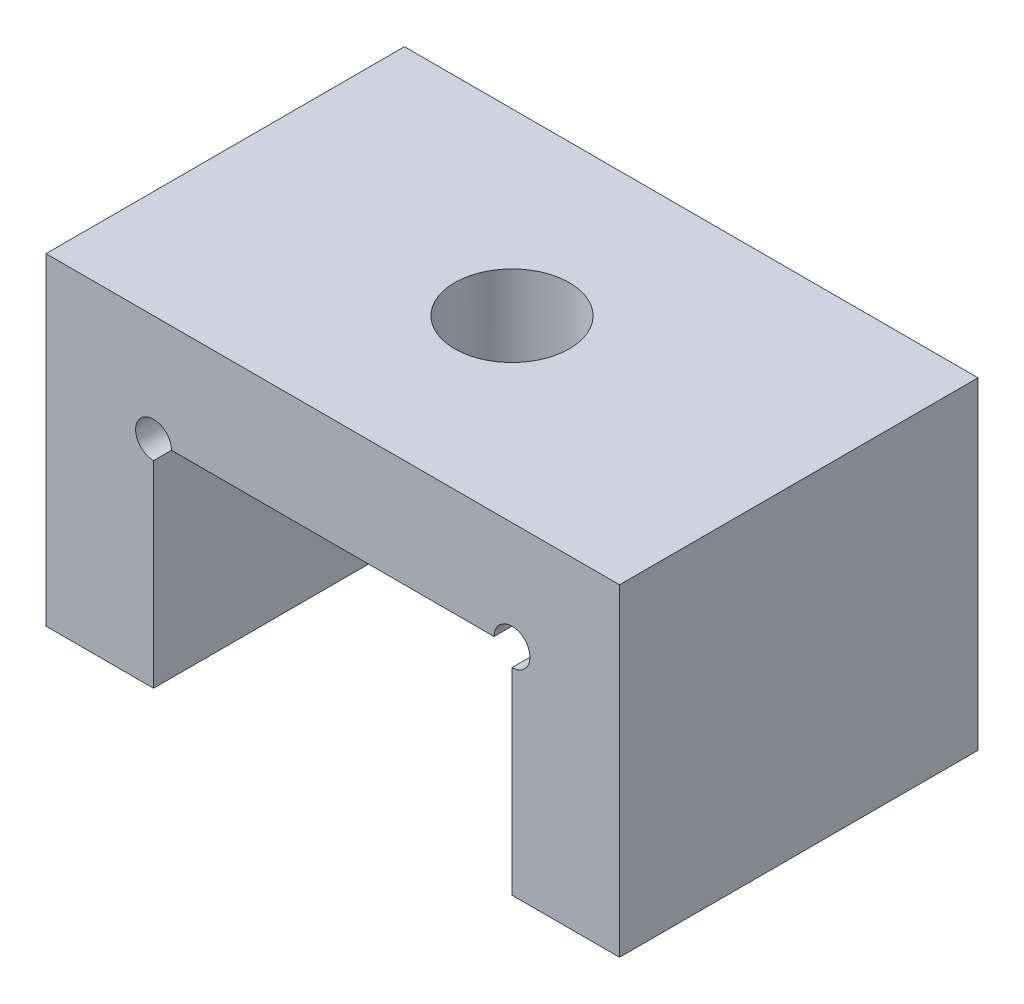
ISO-10303-21;
HEADER;
FILE_DESCRIPTION(('STEP AP214'),'2;1');
FILE_NAME('part.step','',(''),(''),'','','');
FILE_SCHEMA(('AUTOMOTIVE_DESIGN { 1 0 10303 214 1 1 1 1 }'));
ENDSEC;
DATA;
#1=APPLICATION_CONTEXT('core data for automotive mechanical design processes');
#2=APPLICATION_PROTOCOL_DEFINITION('international standard','automotive_design',2000,#1);
#3=PRODUCT_CONTEXT('',#1,'mechanical');
#4=PRODUCT('Part','Part','',(#3));
#5=PRODUCT_RELATED_PRODUCT_CATEGORY('part','',(#4));
#6=PRODUCT_DEFINITION_FORMATION('','',#4);
#7=PRODUCT_DEFINITION_CONTEXT('part definition',#1,'design');
#8=PRODUCT_DEFINITION('design','',#6,#7);
#9=PRODUCT_DEFINITION_SHAPE('','',#8);
#10=(LENGTH_UNIT() NAMED_UNIT(*) SI_UNIT(.MILLI.,.METRE.));
#11=(NAMED_UNIT(*) PLANE_ANGLE_UNIT() SI_UNIT($,.RADIAN.));
#12=(NAMED_UNIT(*) SI_UNIT($,.STERADIAN.) SOLID_ANGLE_UNIT());
#13=UNCERTAINTY_MEASURE_WITH_UNIT(LENGTH_MEASURE(1.E-05),#10,'distance_accuracy_value','');
#14=(GEOMETRIC_REPRESENTATION_CONTEXT(3) GLOBAL_UNCERTAINTY_ASSIGNED_CONTEXT((#13)) GLOBAL_UNIT_ASSIGNED_CONTEXT((#10,
#11,#12)) REPRESENTATION_CONTEXT('',''));
#15=CARTESIAN_POINT('',(0.,0.,0.));
#16=DIRECTION('',(0.,0.,1.));
#17=DIRECTION('',(1.,0.,0.));
#18=AXIS2_PLACEMENT_3D('',#15,#16,#17);
#19=CARTESIAN_POINT('',(0.,0.,10.));
#20=DIRECTION('',(0.,-1.,0.));
#21=DIRECTION('',(0.,0.,-1.));
#22=AXIS2_PLACEMENT_3D('',#19,#20,#21);
#23=PLANE('',#22);
#24=CARTESIAN_POINT('',(0.,0.,5.));
#25=DIRECTION('',(0.,1.,0.));
#26=DIRECTION('',(0.,0.,1.));
#27=AXIS2_PLACEMENT_3D('',#24,#25,#26);
#28=CIRCLE('',#27,1.6);
#29=CARTESIAN_POINT('',(0.,0.,6.6));
#30=VERTEX_POINT('',#29);
#31=EDGE_CURVE('E164',#30,#30,#28,.T.);
#32=ORIENTED_EDGE('',*,*,#31,.F.);
#33=EDGE_LOOP('',(#32));
#34=FACE_BOUND('',#33,.T.);
#35=DIRECTION('',(-1.,0.,0.));
#36=VECTOR('',#35,1.);
#37=CARTESIAN_POINT('',(0.,0.,0.));
#38=LINE('',#37,#36);
#39=CARTESIAN_POINT('',(8.,0.,0.));
#40=VERTEX_POINT('',#39);
#41=CARTESIAN_POINT('',(-8.,0.,0.));
#42=VERTEX_POINT('',#41);
#43=EDGE_CURVE('E163',#40,#42,#38,.T.);
#44=ORIENTED_EDGE('',*,*,#43,.T.);
#45=DIRECTION('',(0.,0.,-1.));
#46=VECTOR('',#45,1.);
#47=CARTESIAN_POINT('',(-8.,0.,10.));
#48=LINE('',#47,#46);
#49=CARTESIAN_POINT('',(-8.,0.,10.));
#50=VERTEX_POINT('',#49);
#51=EDGE_CURVE('E48',#50,#42,#48,.T.);
#52=ORIENTED_EDGE('',*,*,#51,.F.);
#53=DIRECTION('',(-1.,0.,0.));
#54=VECTOR('',#53,1.);
#55=CARTESIAN_POINT('',(8.,0.,10.));
#56=LINE('',#55,#54);
#57=CARTESIAN_POINT('',(8.,0.,10.));
#58=VERTEX_POINT('',#57);
#59=EDGE_CURVE('E144',#58,#50,#56,.T.);
#60=ORIENTED_EDGE('',*,*,#59,.F.);
#61=DIRECTION('',(0.,0.,-1.));
#62=VECTOR('',#61,1.);
#63=CARTESIAN_POINT('',(8.,0.,10.));
#64=LINE('',#63,#62);
#65=EDGE_CURVE('E145',#58,#40,#64,.T.);
#66=ORIENTED_EDGE('',*,*,#65,.T.);
#67=EDGE_LOOP('',(#44,#52,#60,#66));
#68=FACE_BOUND('',#67,.T.);
#69=ADVANCED_FACE('F41',(#34,#68),#23,.F.);
#70=CARTESIAN_POINT('',(-8.,0.,10.));
#71=DIRECTION('',(1.,0.,0.));
#72=DIRECTION('',(0.,0.,-1.));
#73=AXIS2_PLACEMENT_3D('',#70,#71,#72);
#74=PLANE('',#73);
#75=DIRECTION('',(0.,-1.,0.));
#76=VECTOR('',#75,1.);
#77=CARTESIAN_POINT('',(-8.,0.,0.));
#78=LINE('',#77,#76);
#79=CARTESIAN_POINT('',(-8.,-9.,0.));
#80=VERTEX_POINT('',#79);
#81=EDGE_CURVE('E167',#42,#80,#78,.T.);
#82=ORIENTED_EDGE('',*,*,#81,.T.);
#83=DIRECTION('',(0.,0.,-1.));
#84=VECTOR('',#83,1.);
#85=CARTESIAN_POINT('',(-8.,-9.,10.));
#86=LINE('',#85,#84);
#87=CARTESIAN_POINT('',(-8.,-9.,10.));
#88=VERTEX_POINT('',#87);
#89=EDGE_CURVE('E157',#88,#80,#86,.T.);
#90=ORIENTED_EDGE('',*,*,#89,.F.);
#91=DIRECTION('',(0.,-1.,0.));
#92=VECTOR('',#91,1.);
#93=CARTESIAN_POINT('',(-8.,0.,10.));
#94=LINE('',#93,#92);
#95=EDGE_CURVE('E178',#50,#88,#94,.T.);
#96=ORIENTED_EDGE('',*,*,#95,.F.);
#97=ORIENTED_EDGE('',*,*,#51,.T.);
#98=EDGE_LOOP('',(#82,#90,#96,#97));
#99=FACE_BOUND('',#98,.T.);
#100=ADVANCED_FACE('F222',(#99),#74,.F.);
#101=CARTESIAN_POINT('',(-8.,-9.,10.));
#102=DIRECTION('',(0.,1.,0.));
#103=DIRECTION('',(0.,0.,1.));
#104=AXIS2_PLACEMENT_3D('',#101,#102,#103);
#105=PLANE('',#104);
#106=DIRECTION('',(1.,0.,0.));
#107=VECTOR('',#106,1.);
#108=CARTESIAN_POINT('',(-8.,-9.,0.));
#109=LINE('',#108,#107);
#110=CARTESIAN_POINT('',(-5.,-9.,0.));
#111=VERTEX_POINT('',#110);
#112=EDGE_CURVE('E193',#80,#111,#109,.T.);
#113=ORIENTED_EDGE('',*,*,#112,.T.);
#114=DIRECTION('',(0.,0.,-1.));
#115=VECTOR('',#114,1.);
#116=CARTESIAN_POINT('',(-5.,-9.,10.));
#117=LINE('',#116,#115);
#118=CARTESIAN_POINT('',(-5.,-9.,10.));
#119=VERTEX_POINT('',#118);
#120=EDGE_CURVE('E154',#119,#111,#117,.T.);
#121=ORIENTED_EDGE('',*,*,#120,.F.);
#122=DIRECTION('',(1.,0.,0.));
#123=VECTOR('',#122,1.);
#124=CARTESIAN_POINT('',(-8.,-9.,10.));
#125=LINE('',#124,#123);
#126=EDGE_CURVE('E180',#88,#119,#125,.T.);
#127=ORIENTED_EDGE('',*,*,#126,.F.);
#128=ORIENTED_EDGE('',*,*,#89,.T.);
#129=EDGE_LOOP('',(#113,#121,#127,#128));
#130=FACE_BOUND('',#129,.T.);
#131=ADVANCED_FACE('F220',(#130),#105,.F.);
#132=CARTESIAN_POINT('',(-5.,-9.,10.));
#133=DIRECTION('',(-1.,0.,0.));
#134=DIRECTION('',(0.,0.,1.));
#135=AXIS2_PLACEMENT_3D('',#132,#133,#134);
#136=PLANE('',#135);
#137=DIRECTION('',(0.,1.,0.));
#138=VECTOR('',#137,1.);
#139=CARTESIAN_POINT('',(-5.,-9.,0.));
#140=LINE('',#139,#138);
#141=CARTESIAN_POINT('',(-5.,-3.5,0.));
#142=VERTEX_POINT('',#141);
#143=EDGE_CURVE('E138',#111,#142,#140,.T.);
#144=ORIENTED_EDGE('',*,*,#143,.T.);
#145=DIRECTION('',(0.,0.,1.));
#146=VECTOR('',#145,1.);
#147=CARTESIAN_POINT('',(-5.,-3.5,0.));
#148=LINE('',#147,#146);
#149=CARTESIAN_POINT('',(-5.,-3.5,10.));
#150=VERTEX_POINT('',#149);
#151=EDGE_CURVE('E55',#142,#150,#148,.T.);
#152=ORIENTED_EDGE('',*,*,#151,.T.);
#153=DIRECTION('',(0.,1.,0.));
#154=VECTOR('',#153,1.);
#155=CARTESIAN_POINT('',(-5.,-9.,10.));
#156=LINE('',#155,#154);
#157=EDGE_CURVE('E182',#119,#150,#156,.T.);
#158=ORIENTED_EDGE('',*,*,#157,.F.);
#159=ORIENTED_EDGE('',*,*,#120,.T.);
#160=EDGE_LOOP('',(#144,#152,#158,#159));
#161=FACE_BOUND('',#160,.T.);
#162=ADVANCED_FACE('F197',(#161),#136,.F.);
#163=CARTESIAN_POINT('',(-5.,-3.,10.));
#164=DIRECTION('',(0.,1.,0.));
#165=DIRECTION('',(-1.,0.,0.));
#166=AXIS2_PLACEMENT_3D('',#163,#164,#165);
#167=PLANE('',#166);
#168=CARTESIAN_POINT('',(0.,-3.,5.));
#169=DIRECTION('',(0.,1.,0.));
#170=DIRECTION('',(-1.,0.,0.));
#171=AXIS2_PLACEMENT_3D('',#168,#169,#170);
#172=CIRCLE('',#171,1.6);
#173=CARTESIAN_POINT('',(-1.6,-3.,5.));
#174=VERTEX_POINT('',#173);
#175=EDGE_CURVE('E161',#174,#174,#172,.T.);
#176=ORIENTED_EDGE('',*,*,#175,.T.);
#177=EDGE_LOOP('',(#176));
#178=FACE_BOUND('',#177,.T.);
#179=DIRECTION('',(1.,0.,0.));
#180=VECTOR('',#179,1.);
#181=CARTESIAN_POINT('',(-5.,-3.,10.));
#182=LINE('',#181,#180);
#183=CARTESIAN_POINT('',(-4.5,-3.,10.));
#184=VERTEX_POINT('',#183);
#185=CARTESIAN_POINT('',(4.5,-3.,10.));
#186=VERTEX_POINT('',#185);
#187=EDGE_CURVE('E185',#184,#186,#182,.T.);
#188=ORIENTED_EDGE('',*,*,#187,.F.);
#189=DIRECTION('',(0.,0.,1.));
#190=VECTOR('',#189,1.);
#191=CARTESIAN_POINT('',(-4.5,-3.,0.));
#192=LINE('',#191,#190);
#193=CARTESIAN_POINT('',(-4.5,-3.,0.));
#194=VERTEX_POINT('',#193);
#195=EDGE_CURVE('E173',#184,#194,#192,.F.);
#196=ORIENTED_EDGE('',*,*,#195,.T.);
#197=DIRECTION('',(1.,0.,0.));
#198=VECTOR('',#197,1.);
#199=CARTESIAN_POINT('',(-5.,-3.,0.));
#200=LINE('',#199,#198);
#201=CARTESIAN_POINT('',(4.5,-3.,0.));
#202=VERTEX_POINT('',#201);
#203=EDGE_CURVE('E134',#194,#202,#200,.T.);
#204=ORIENTED_EDGE('',*,*,#203,.T.);
#205=DIRECTION('',(0.,0.,1.));
#206=VECTOR('',#205,1.);
#207=CARTESIAN_POINT('',(4.5,-3.,0.));
#208=LINE('',#207,#206);
#209=EDGE_CURVE('E63',#202,#186,#208,.T.);
#210=ORIENTED_EDGE('',*,*,#209,.T.);
#211=EDGE_LOOP('',(#188,#196,#204,#210));
#212=FACE_BOUND('',#211,.T.);
#213=ADVANCED_FACE('F211',(#178,#212),#167,.F.);
#214=CARTESIAN_POINT('',(5.,-3.,10.));
#215=DIRECTION('',(1.,0.,0.));
#216=DIRECTION('',(0.,1.,0.));
#217=AXIS2_PLACEMENT_3D('',#214,#215,#216);
#218=PLANE('',#217);
#219=DIRECTION('',(0.,-1.,0.));
#220=VECTOR('',#219,1.);
#221=CARTESIAN_POINT('',(5.,-3.,10.));
#222=LINE('',#221,#220);
#223=CARTESIAN_POINT('',(5.,-3.5,10.));
#224=VERTEX_POINT('',#223);
#225=CARTESIAN_POINT('',(5.,-9.00000000000001,10.));
#226=VERTEX_POINT('',#225);
#227=EDGE_CURVE('E127',#224,#226,#222,.T.);
#228=ORIENTED_EDGE('',*,*,#227,.F.);
#229=DIRECTION('',(0.,0.,1.));
#230=VECTOR('',#229,1.);
#231=CARTESIAN_POINT('',(5.,-3.5,0.));
#232=LINE('',#231,#230);
#233=CARTESIAN_POINT('',(5.,-3.5,0.));
#234=VERTEX_POINT('',#233);
#235=EDGE_CURVE('E115',#224,#234,#232,.F.);
#236=ORIENTED_EDGE('',*,*,#235,.T.);
#237=DIRECTION('',(0.,-1.,0.));
#238=VECTOR('',#237,1.);
#239=CARTESIAN_POINT('',(5.,-3.,0.));
#240=LINE('',#239,#238);
#241=CARTESIAN_POINT('',(5.,-9.00000000000001,0.));
#242=VERTEX_POINT('',#241);
#243=EDGE_CURVE('E125',#234,#242,#240,.T.);
#244=ORIENTED_EDGE('',*,*,#243,.T.);
#245=DIRECTION('',(0.,0.,-1.));
#246=VECTOR('',#245,1.);
#247=CARTESIAN_POINT('',(5.,-9.00000000000001,10.));
#248=LINE('',#247,#246);
#249=EDGE_CURVE('E152',#226,#242,#248,.T.);
#250=ORIENTED_EDGE('',*,*,#249,.F.);
#251=EDGE_LOOP('',(#228,#236,#244,#250));
#252=FACE_BOUND('',#251,.T.);
#253=ADVANCED_FACE('F123',(#252),#218,.F.);
#254=CARTESIAN_POINT('',(5.,-9.00000000000001,10.));
#255=DIRECTION('',(0.,1.,0.));
#256=DIRECTION('',(-1.,0.,0.));
#257=AXIS2_PLACEMENT_3D('',#254,#255,#256);
#258=PLANE('',#257);
#259=DIRECTION('',(1.,0.,0.));
#260=VECTOR('',#259,1.);
#261=CARTESIAN_POINT('',(5.,-9.00000000000001,0.));
#262=LINE('',#261,#260);
#263=CARTESIAN_POINT('',(8.,-9.,0.));
#264=VERTEX_POINT('',#263);
#265=EDGE_CURVE('E133',#242,#264,#262,.T.);
#266=ORIENTED_EDGE('',*,*,#265,.T.);
#267=DIRECTION('',(0.,0.,-1.));
#268=VECTOR('',#267,1.);
#269=CARTESIAN_POINT('',(8.,-9.,10.));
#270=LINE('',#269,#268);
#271=CARTESIAN_POINT('',(8.,-9.,10.));
#272=VERTEX_POINT('',#271);
#273=EDGE_CURVE('E148',#272,#264,#270,.T.);
#274=ORIENTED_EDGE('',*,*,#273,.F.);
#275=DIRECTION('',(1.,0.,0.));
#276=VECTOR('',#275,1.);
#277=CARTESIAN_POINT('',(5.,-9.00000000000001,10.));
#278=LINE('',#277,#276);
#279=EDGE_CURVE('E189',#226,#272,#278,.T.);
#280=ORIENTED_EDGE('',*,*,#279,.F.);
#281=ORIENTED_EDGE('',*,*,#249,.T.);
#282=EDGE_LOOP('',(#266,#274,#280,#281));
#283=FACE_BOUND('',#282,.T.);
#284=ADVANCED_FACE('F233',(#283),#258,.F.);
#285=CARTESIAN_POINT('',(8.,-9.,10.));
#286=DIRECTION('',(-1.,0.,0.));
#287=DIRECTION('',(0.,0.,1.));
#288=AXIS2_PLACEMENT_3D('',#285,#286,#287);
#289=PLANE('',#288);
#290=DIRECTION('',(0.,1.,0.));
#291=VECTOR('',#290,1.);
#292=CARTESIAN_POINT('',(8.,-9.,0.));
#293=LINE('',#292,#291);
#294=EDGE_CURVE('E136',#264,#40,#293,.T.);
#295=ORIENTED_EDGE('',*,*,#294,.T.);
#296=ORIENTED_EDGE('',*,*,#65,.F.);
#297=DIRECTION('',(0.,1.,0.));
#298=VECTOR('',#297,1.);
#299=CARTESIAN_POINT('',(8.,-9.,10.));
#300=LINE('',#299,#298);
#301=EDGE_CURVE('E149',#272,#58,#300,.T.);
#302=ORIENTED_EDGE('',*,*,#301,.F.);
#303=ORIENTED_EDGE('',*,*,#273,.T.);
#304=EDGE_LOOP('',(#295,#296,#302,#303));
#305=FACE_BOUND('',#304,.T.);
#306=ADVANCED_FACE('F227',(#305),#289,.F.);
#307=CARTESIAN_POINT('',(0.,0.,10.));
#308=DIRECTION('',(0.,0.,1.));
#309=DIRECTION('',(1.,0.,0.));
#310=AXIS2_PLACEMENT_3D('',#307,#308,#309);
#311=PLANE('',#310);
#312=CARTESIAN_POINT('',(-5.,-3.,10.));
#313=DIRECTION('',(0.,0.,1.));
#314=DIRECTION('',(1.,0.,0.));
#315=AXIS2_PLACEMENT_3D('',#312,#313,#314);
#316=CIRCLE('',#315,0.5);
#317=EDGE_CURVE('E203',#184,#150,#316,.T.);
#318=ORIENTED_EDGE('',*,*,#317,.F.);
#319=ORIENTED_EDGE('',*,*,#187,.T.);
#320=CARTESIAN_POINT('',(5.,-3.,10.));
#321=DIRECTION('',(0.,0.,1.));
#322=DIRECTION('',(1.,0.,0.));
#323=AXIS2_PLACEMENT_3D('',#320,#321,#322);
#324=CIRCLE('',#323,0.500000000000001);
#325=EDGE_CURVE('E205',#224,#186,#324,.T.);
#326=ORIENTED_EDGE('',*,*,#325,.F.);
#327=ORIENTED_EDGE('',*,*,#227,.T.);
#328=ORIENTED_EDGE('',*,*,#279,.T.);
#329=ORIENTED_EDGE('',*,*,#301,.T.);
#330=ORIENTED_EDGE('',*,*,#59,.T.);
#331=ORIENTED_EDGE('',*,*,#95,.T.);
#332=ORIENTED_EDGE('',*,*,#126,.T.);
#333=ORIENTED_EDGE('',*,*,#157,.T.);
#334=EDGE_LOOP('',(#318,#319,#326,#327,#328,#329,#330,#331,#332,#333));
#335=FACE_BOUND('',#334,.T.);
#336=ADVANCED_FACE('F215',(#335),#311,.T.);
#337=CARTESIAN_POINT('',(0.,0.,0.));
#338=DIRECTION('',(0.,0.,1.));
#339=DIRECTION('',(1.,0.,0.));
#340=AXIS2_PLACEMENT_3D('',#337,#338,#339);
#341=PLANE('',#340);
#342=ORIENTED_EDGE('',*,*,#203,.F.);
#343=CARTESIAN_POINT('',(-5.,-3.,0.));
#344=DIRECTION('',(0.,0.,1.));
#345=DIRECTION('',(1.,0.,0.));
#346=AXIS2_PLACEMENT_3D('',#343,#344,#345);
#347=CIRCLE('',#346,0.5);
#348=EDGE_CURVE('E128',#194,#142,#347,.T.);
#349=ORIENTED_EDGE('',*,*,#348,.T.);
#350=ORIENTED_EDGE('',*,*,#143,.F.);
#351=ORIENTED_EDGE('',*,*,#112,.F.);
#352=ORIENTED_EDGE('',*,*,#81,.F.);
#353=ORIENTED_EDGE('',*,*,#43,.F.);
#354=ORIENTED_EDGE('',*,*,#294,.F.);
#355=ORIENTED_EDGE('',*,*,#265,.F.);
#356=ORIENTED_EDGE('',*,*,#243,.F.);
#357=CARTESIAN_POINT('',(5.,-3.,0.));
#358=DIRECTION('',(0.,0.,1.));
#359=DIRECTION('',(1.,0.,0.));
#360=AXIS2_PLACEMENT_3D('',#357,#358,#359);
#361=CIRCLE('',#360,0.500000000000001);
#362=EDGE_CURVE('E11',#234,#202,#361,.T.);
#363=ORIENTED_EDGE('',*,*,#362,.T.);
#364=EDGE_LOOP('',(#342,#349,#350,#351,#352,#353,#354,#355,#356,#363));
#365=FACE_BOUND('',#364,.T.);
#366=ADVANCED_FACE('F131',(#365),#341,.F.);
#367=CARTESIAN_POINT('',(0.,-9.00000000000001,5.));
#368=DIRECTION('',(0.,1.,0.));
#369=DIRECTION('',(0.,0.,1.));
#370=AXIS2_PLACEMENT_3D('',#367,#368,#369);
#371=CYLINDRICAL_SURFACE('',#370,1.6);
#372=ORIENTED_EDGE('',*,*,#31,.T.);
#373=EDGE_LOOP('',(#372));
#374=FACE_BOUND('',#373,.T.);
#375=ORIENTED_EDGE('',*,*,#175,.F.);
#376=EDGE_LOOP('',(#375));
#377=FACE_BOUND('',#376,.T.);
#378=ADVANCED_FACE('F280',(#374,#377),#371,.F.);
#379=CARTESIAN_POINT('',(5.,-3.,0.));
#380=DIRECTION('',(0.,0.,1.));
#381=DIRECTION('',(1.,0.,0.));
#382=AXIS2_PLACEMENT_3D('',#379,#380,#381);
#383=CYLINDRICAL_SURFACE('',#382,0.500000000000001);
#384=ORIENTED_EDGE('',*,*,#362,.F.);
#385=ORIENTED_EDGE('',*,*,#235,.F.);
#386=ORIENTED_EDGE('',*,*,#325,.T.);
#387=ORIENTED_EDGE('',*,*,#209,.F.);
#388=EDGE_LOOP('',(#384,#385,#386,#387));
#389=FACE_BOUND('',#388,.T.);
#390=ADVANCED_FACE('F114',(#389),#383,.F.);
#391=CARTESIAN_POINT('',(-5.,-3.,0.));
#392=DIRECTION('',(0.,0.,1.));
#393=DIRECTION('',(1.,0.,0.));
#394=AXIS2_PLACEMENT_3D('',#391,#392,#393);
#395=CYLINDRICAL_SURFACE('',#394,0.5);
#396=ORIENTED_EDGE('',*,*,#348,.F.);
#397=ORIENTED_EDGE('',*,*,#195,.F.);
#398=ORIENTED_EDGE('',*,*,#317,.T.);
#399=ORIENTED_EDGE('',*,*,#151,.F.);
#400=EDGE_LOOP('',(#396,#397,#398,#399));
#401=FACE_BOUND('',#400,.T.);
#402=ADVANCED_FACE('F213',(#401),#395,.F.);
#403=CLOSED_SHELL('',(#69,#100,#131,#162,#213,#253,#284,#306,#336,#366,#378,#390,#402));
#404=MANIFOLD_SOLID_BREP('B2',#403);
#405=ADVANCED_BREP_SHAPE_REPRESENTATION('',(#18,#404),#14);
#406=SHAPE_DEFINITION_REPRESENTATION(#9,#405);
ENDSEC;
END-ISO-10303-21;
